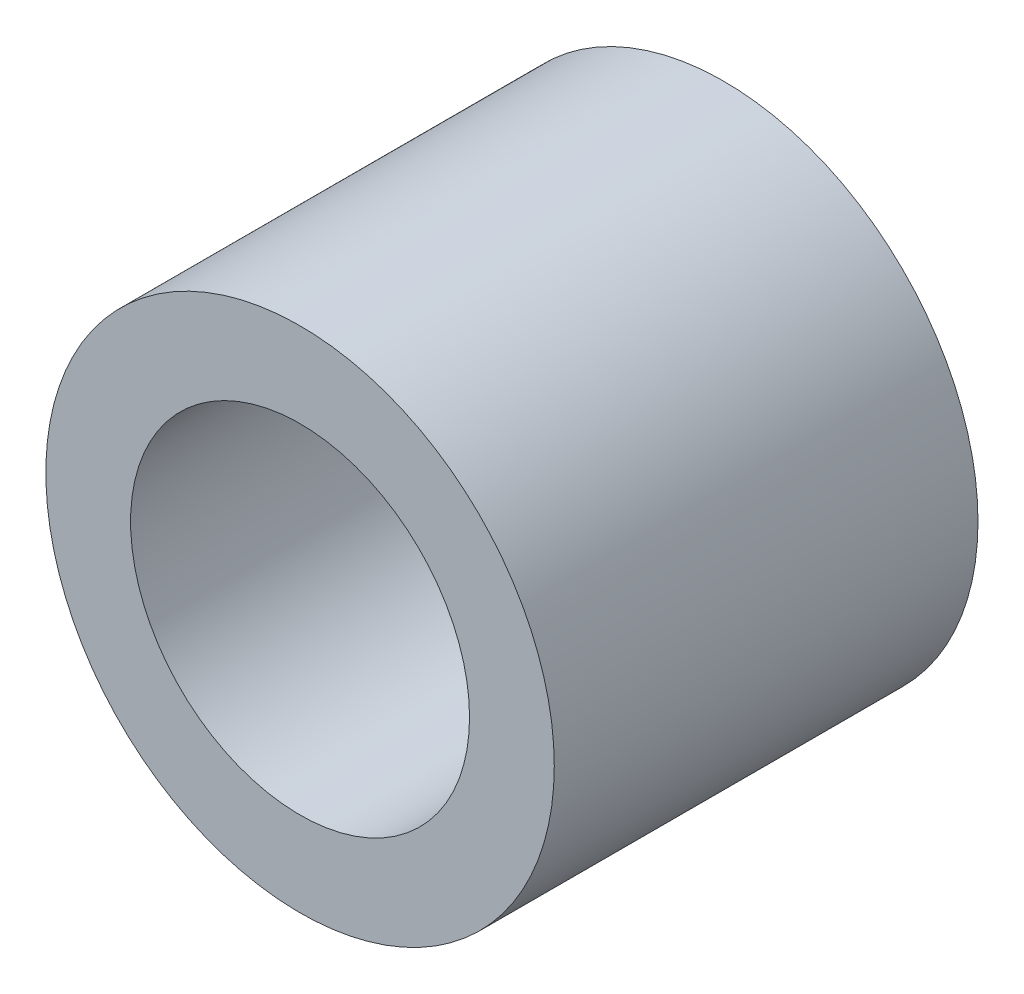
ISO-10303-21;
HEADER;
FILE_DESCRIPTION(('STEP AP214'),'2;1');
FILE_NAME('part.step','',(''),(''),'','','');
FILE_SCHEMA(('AUTOMOTIVE_DESIGN { 1 0 10303 214 1 1 1 1 }'));
ENDSEC;
DATA;
#1=APPLICATION_CONTEXT('core data for automotive mechanical design processes');
#2=APPLICATION_PROTOCOL_DEFINITION('international standard','automotive_design',2000,#1);
#3=PRODUCT_CONTEXT('',#1,'mechanical');
#4=PRODUCT('Part','Part','',(#3));
#5=PRODUCT_RELATED_PRODUCT_CATEGORY('part','',(#4));
#6=PRODUCT_DEFINITION_FORMATION('','',#4);
#7=PRODUCT_DEFINITION_CONTEXT('part definition',#1,'design');
#8=PRODUCT_DEFINITION('design','',#6,#7);
#9=PRODUCT_DEFINITION_SHAPE('','',#8);
#10=(LENGTH_UNIT() NAMED_UNIT(*) SI_UNIT(.MILLI.,.METRE.));
#11=(NAMED_UNIT(*) PLANE_ANGLE_UNIT() SI_UNIT($,.RADIAN.));
#12=(NAMED_UNIT(*) SI_UNIT($,.STERADIAN.) SOLID_ANGLE_UNIT());
#13=UNCERTAINTY_MEASURE_WITH_UNIT(LENGTH_MEASURE(1.E-05),#10,'distance_accuracy_value','');
#14=(GEOMETRIC_REPRESENTATION_CONTEXT(3) GLOBAL_UNCERTAINTY_ASSIGNED_CONTEXT((#13)) GLOBAL_UNIT_ASSIGNED_CONTEXT((#10,
#11,#12)) REPRESENTATION_CONTEXT('',''));
#15=CARTESIAN_POINT('',(0.,0.,0.));
#16=DIRECTION('',(0.,0.,1.));
#17=DIRECTION('',(1.,0.,0.));
#18=AXIS2_PLACEMENT_3D('',#15,#16,#17);
#19=CARTESIAN_POINT('',(0.,0.,500.));
#20=DIRECTION('',(0.,0.,1.));
#21=DIRECTION('',(1.,0.,0.));
#22=AXIS2_PLACEMENT_3D('',#19,#20,#21);
#23=PLANE('',#22);
#24=CARTESIAN_POINT('',(0.,0.,500.));
#25=DIRECTION('',(0.,0.,1.));
#26=DIRECTION('',(1.,0.,0.));
#27=AXIS2_PLACEMENT_3D('',#24,#25,#26);
#28=CIRCLE('',#27,300.);
#29=CARTESIAN_POINT('',(300.,0.,500.));
#30=VERTEX_POINT('',#29);
#31=EDGE_CURVE('E10',#30,#30,#28,.T.);
#32=ORIENTED_EDGE('',*,*,#31,.T.);
#33=EDGE_LOOP('',(#32));
#34=FACE_BOUND('',#33,.T.);
#35=CARTESIAN_POINT('',(0.,0.,500.));
#36=DIRECTION('',(0.,0.,1.));
#37=DIRECTION('',(1.,0.,0.));
#38=AXIS2_PLACEMENT_3D('',#35,#36,#37);
#39=CIRCLE('',#38,200.);
#40=CARTESIAN_POINT('',(200.,0.,500.));
#41=VERTEX_POINT('',#40);
#42=EDGE_CURVE('E41',#41,#41,#39,.T.);
#43=ORIENTED_EDGE('',*,*,#42,.F.);
#44=EDGE_LOOP('',(#43));
#45=FACE_BOUND('',#44,.T.);
#46=ADVANCED_FACE('F30',(#34,#45),#23,.T.);
#47=CARTESIAN_POINT('',(0.,0.,0.));
#48=DIRECTION('',(0.,0.,1.));
#49=DIRECTION('',(1.,0.,0.));
#50=AXIS2_PLACEMENT_3D('',#47,#48,#49);
#51=PLANE('',#50);
#52=CARTESIAN_POINT('',(0.,0.,0.));
#53=DIRECTION('',(0.,0.,1.));
#54=DIRECTION('',(1.,0.,0.));
#55=AXIS2_PLACEMENT_3D('',#52,#53,#54);
#56=CIRCLE('',#55,300.);
#57=CARTESIAN_POINT('',(300.,0.,0.));
#58=VERTEX_POINT('',#57);
#59=EDGE_CURVE('E34',#58,#58,#56,.T.);
#60=ORIENTED_EDGE('',*,*,#59,.F.);
#61=EDGE_LOOP('',(#60));
#62=FACE_BOUND('',#61,.T.);
#63=CARTESIAN_POINT('',(0.,0.,0.));
#64=DIRECTION('',(0.,0.,1.));
#65=DIRECTION('',(1.,0.,0.));
#66=AXIS2_PLACEMENT_3D('',#63,#64,#65);
#67=CIRCLE('',#66,200.);
#68=CARTESIAN_POINT('',(200.,0.,0.));
#69=VERTEX_POINT('',#68);
#70=EDGE_CURVE('E43',#69,#69,#67,.T.);
#71=ORIENTED_EDGE('',*,*,#70,.T.);
#72=EDGE_LOOP('',(#71));
#73=FACE_BOUND('',#72,.T.);
#74=ADVANCED_FACE('F53',(#62,#73),#51,.F.);
#75=CARTESIAN_POINT('',(0.,0.,500.));
#76=DIRECTION('',(0.,0.,-1.));
#77=DIRECTION('',(-1.,0.,0.));
#78=AXIS2_PLACEMENT_3D('',#75,#76,#77);
#79=CYLINDRICAL_SURFACE('',#78,300.);
#80=ORIENTED_EDGE('',*,*,#31,.F.);
#81=EDGE_LOOP('',(#80));
#82=FACE_BOUND('',#81,.T.);
#83=ORIENTED_EDGE('',*,*,#59,.T.);
#84=EDGE_LOOP('',(#83));
#85=FACE_BOUND('',#84,.T.);
#86=ADVANCED_FACE('F32',(#82,#85),#79,.T.);
#87=CARTESIAN_POINT('',(0.,0.,500.));
#88=DIRECTION('',(0.,0.,-1.));
#89=DIRECTION('',(-1.,0.,0.));
#90=AXIS2_PLACEMENT_3D('',#87,#88,#89);
#91=CYLINDRICAL_SURFACE('',#90,200.);
#92=ORIENTED_EDGE('',*,*,#42,.T.);
#93=EDGE_LOOP('',(#92));
#94=FACE_BOUND('',#93,.T.);
#95=ORIENTED_EDGE('',*,*,#70,.F.);
#96=EDGE_LOOP('',(#95));
#97=FACE_BOUND('',#96,.T.);
#98=ADVANCED_FACE('F49',(#94,#97),#91,.F.);
#99=CLOSED_SHELL('',(#46,#74,#86,#98));
#100=MANIFOLD_SOLID_BREP('B2',#99);
#101=ADVANCED_BREP_SHAPE_REPRESENTATION('',(#18,#100),#14);
#102=SHAPE_DEFINITION_REPRESENTATION(#9,#101);
ENDSEC;
END-ISO-10303-21;
